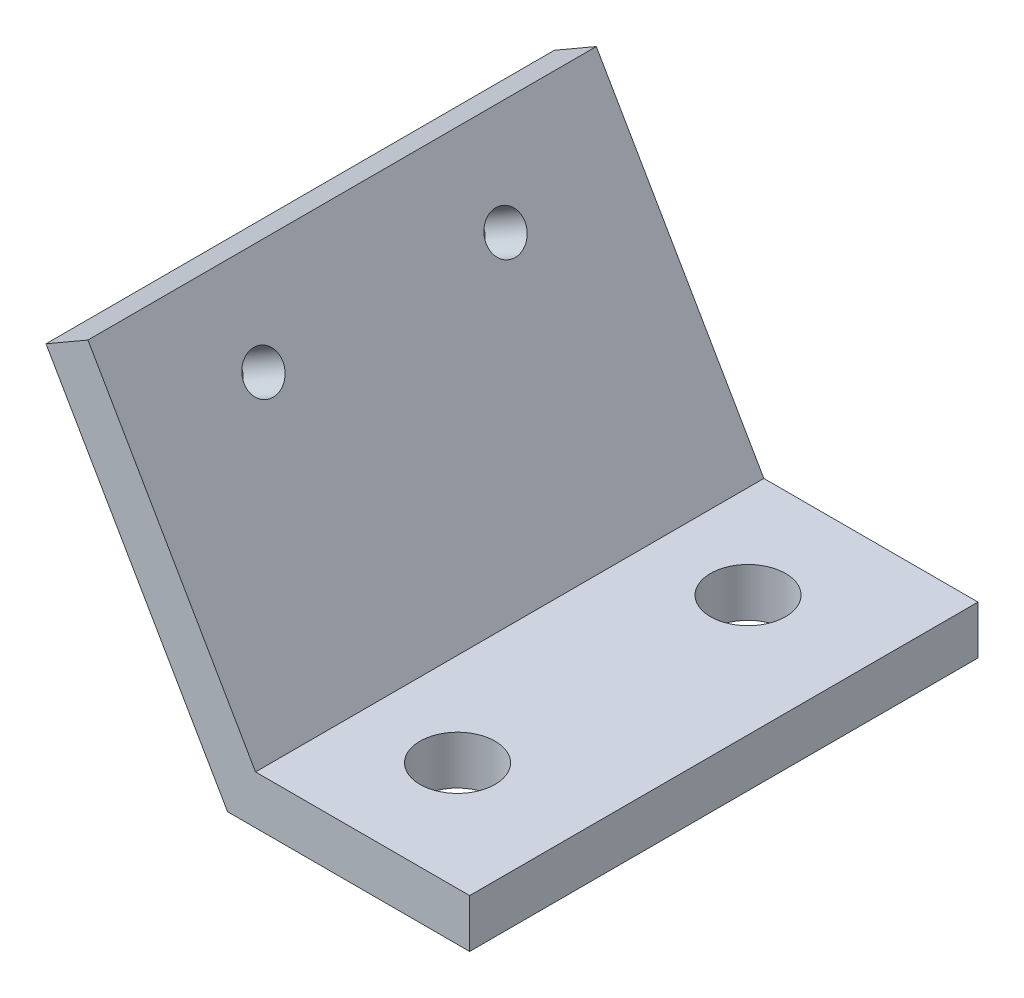
ISO-10303-21;
HEADER;
FILE_DESCRIPTION(('STEP AP214'),'2;1');
FILE_NAME('part.step','',(''),(''),'','','');
FILE_SCHEMA(('AUTOMOTIVE_DESIGN { 1 0 10303 214 1 1 1 1 }'));
ENDSEC;
DATA;
#1=APPLICATION_CONTEXT('core data for automotive mechanical design processes');
#2=APPLICATION_PROTOCOL_DEFINITION('international standard','automotive_design',2000,#1);
#3=PRODUCT_CONTEXT('',#1,'mechanical');
#4=PRODUCT('Part','Part','',(#3));
#5=PRODUCT_RELATED_PRODUCT_CATEGORY('part','',(#4));
#6=PRODUCT_DEFINITION_FORMATION('','',#4);
#7=PRODUCT_DEFINITION_CONTEXT('part definition',#1,'design');
#8=PRODUCT_DEFINITION('design','',#6,#7);
#9=PRODUCT_DEFINITION_SHAPE('','',#8);
#10=(LENGTH_UNIT() NAMED_UNIT(*) SI_UNIT(.MILLI.,.METRE.));
#11=(NAMED_UNIT(*) PLANE_ANGLE_UNIT() SI_UNIT($,.RADIAN.));
#12=(NAMED_UNIT(*) SI_UNIT($,.STERADIAN.) SOLID_ANGLE_UNIT());
#13=UNCERTAINTY_MEASURE_WITH_UNIT(LENGTH_MEASURE(1.E-05),#10,'distance_accuracy_value','');
#14=(GEOMETRIC_REPRESENTATION_CONTEXT(3) GLOBAL_UNCERTAINTY_ASSIGNED_CONTEXT((#13)) GLOBAL_UNIT_ASSIGNED_CONTEXT((#10,
#11,#12)) REPRESENTATION_CONTEXT('',''));
#15=CARTESIAN_POINT('',(0.,0.,0.));
#16=DIRECTION('',(0.,0.,1.));
#17=DIRECTION('',(1.,0.,0.));
#18=AXIS2_PLACEMENT_3D('',#15,#16,#17);
#19=CARTESIAN_POINT('',(-46.2359259339853,-3.805163094229,42.));
#20=DIRECTION('',(-0.866025403784439,-0.5,0.));
#21=DIRECTION('',(0.5,-0.866025403784439,0.));
#22=AXIS2_PLACEMENT_3D('',#19,#20,#21);
#23=PLANE('',#22);
#24=CARTESIAN_POINT('',(-42.7359259339853,-9.86734092072007,31.));
#25=DIRECTION('',(-0.866025403784439,-0.5,0.));
#26=DIRECTION('',(0.5,-0.866025403784439,0.));
#27=AXIS2_PLACEMENT_3D('',#24,#25,#26);
#28=CIRCLE('',#27,1.6);
#29=CARTESIAN_POINT('',(-41.9359259339853,-11.2529815667752,31.));
#30=VERTEX_POINT('',#29);
#31=EDGE_CURVE('E1376',#30,#30,#28,.T.);
#32=ORIENTED_EDGE('',*,*,#31,.T.);
#33=EDGE_LOOP('',(#32));
#34=FACE_BOUND('',#33,.T.);
#35=CARTESIAN_POINT('',(-42.7359259339853,-9.86734092072007,11.));
#36=DIRECTION('',(-0.866025403784439,-0.5,0.));
#37=DIRECTION('',(0.5,-0.866025403784439,0.));
#38=AXIS2_PLACEMENT_3D('',#35,#36,#37);
#39=CIRCLE('',#38,1.6);
#40=CARTESIAN_POINT('',(-41.9359259339853,-11.2529815667752,11.));
#41=VERTEX_POINT('',#40);
#42=EDGE_CURVE('E1404',#41,#41,#39,.T.);
#43=ORIENTED_EDGE('',*,*,#42,.T.);
#44=EDGE_LOOP('',(#43));
#45=FACE_BOUND('',#44,.T.);
#46=DIRECTION('',(-0.5,0.866025403784438,0.));
#47=VECTOR('',#46,1.);
#48=CARTESIAN_POINT('',(-46.2359259339853,-3.805163094229,0.));
#49=LINE('',#48,#47);
#50=CARTESIAN_POINT('',(-32.3906264723646,-27.7859252077621,0.));
#51=VERTEX_POINT('',#50);
#52=CARTESIAN_POINT('',(-46.2359259339853,-3.805163094229,0.));
#53=VERTEX_POINT('',#52);
#54=EDGE_CURVE('E1374',#51,#53,#49,.T.);
#55=ORIENTED_EDGE('',*,*,#54,.T.);
#56=DIRECTION('',(0.,0.,-1.));
#57=VECTOR('',#56,1.);
#58=CARTESIAN_POINT('',(-46.2359259339853,-3.805163094229,42.));
#59=LINE('',#58,#57);
#60=CARTESIAN_POINT('',(-46.2359259339853,-3.805163094229,42.));
#61=VERTEX_POINT('',#60);
#62=EDGE_CURVE('E12',#61,#53,#59,.T.);
#63=ORIENTED_EDGE('',*,*,#62,.F.);
#64=DIRECTION('',(-0.5,0.866025403784438,0.));
#65=VECTOR('',#64,1.);
#66=CARTESIAN_POINT('',(-46.2359259339853,-3.805163094229,42.));
#67=LINE('',#66,#65);
#68=CARTESIAN_POINT('',(-32.3906264723646,-27.7859252077621,42.));
#69=VERTEX_POINT('',#68);
#70=EDGE_CURVE('E1386',#69,#61,#67,.T.);
#71=ORIENTED_EDGE('',*,*,#70,.F.);
#72=DIRECTION('',(0.,0.,-1.));
#73=VECTOR('',#72,1.);
#74=CARTESIAN_POINT('',(-32.3906264723646,-27.7859252077621,42.));
#75=LINE('',#74,#73);
#76=EDGE_CURVE('E1370',#69,#51,#75,.T.);
#77=ORIENTED_EDGE('',*,*,#76,.T.);
#78=EDGE_LOOP('',(#55,#63,#71,#77));
#79=FACE_BOUND('',#78,.T.);
#80=ADVANCED_FACE('F1281',(#34,#45,#79),#23,.F.);
#81=CARTESIAN_POINT('',(-49.7000275491231,-5.805163094229,42.));
#82=DIRECTION('',(0.500000000000002,-0.866025403784438,0.));
#83=DIRECTION('',(0.866025403784438,0.500000000000002,0.));
#84=AXIS2_PLACEMENT_3D('',#81,#82,#83);
#85=PLANE('',#84);
#86=DIRECTION('',(-0.866025403784438,-0.500000000000002,0.));
#87=VECTOR('',#86,1.);
#88=CARTESIAN_POINT('',(-49.7000275491231,-5.805163094229,0.));
#89=LINE('',#88,#87);
#90=CARTESIAN_POINT('',(-49.7000275491231,-5.805163094229,0.));
#91=VERTEX_POINT('',#90);
#92=EDGE_CURVE('E1380',#53,#91,#89,.T.);
#93=ORIENTED_EDGE('',*,*,#92,.T.);
#94=DIRECTION('',(0.,0.,-1.));
#95=VECTOR('',#94,1.);
#96=CARTESIAN_POINT('',(-49.7000275491231,-5.805163094229,42.));
#97=LINE('',#96,#95);
#98=CARTESIAN_POINT('',(-49.7000275491231,-5.805163094229,42.));
#99=VERTEX_POINT('',#98);
#100=EDGE_CURVE('E1292',#99,#91,#97,.T.);
#101=ORIENTED_EDGE('',*,*,#100,.F.);
#102=DIRECTION('',(-0.866025403784438,-0.500000000000002,0.));
#103=VECTOR('',#102,1.);
#104=CARTESIAN_POINT('',(-49.7000275491231,-5.805163094229,42.));
#105=LINE('',#104,#103);
#106=EDGE_CURVE('E1340',#61,#99,#105,.T.);
#107=ORIENTED_EDGE('',*,*,#106,.F.);
#108=ORIENTED_EDGE('',*,*,#62,.T.);
#109=EDGE_LOOP('',(#93,#101,#107,#108));
#110=FACE_BOUND('',#109,.T.);
#111=ADVANCED_FACE('F1451',(#110),#85,.F.);
#112=CARTESIAN_POINT('',(-34.700027549123,-31.7859252077621,42.));
#113=DIRECTION('',(0.866025403784438,0.500000000000002,0.));
#114=DIRECTION('',(-0.500000000000002,0.866025403784438,0.));
#115=AXIS2_PLACEMENT_3D('',#112,#113,#114);
#116=PLANE('',#115);
#117=CARTESIAN_POINT('',(-46.2000275491231,-11.8673409207201,31.));
#118=DIRECTION('',(0.866025403784438,0.500000000000002,0.));
#119=DIRECTION('',(-0.500000000000002,0.866025403784438,0.));
#120=AXIS2_PLACEMENT_3D('',#117,#118,#119);
#121=CIRCLE('',#120,1.6);
#122=CARTESIAN_POINT('',(-47.0000275491231,-10.481700274665,31.));
#123=VERTEX_POINT('',#122);
#124=EDGE_CURVE('E1402',#123,#123,#121,.T.);
#125=ORIENTED_EDGE('',*,*,#124,.T.);
#126=EDGE_LOOP('',(#125));
#127=FACE_BOUND('',#126,.T.);
#128=CARTESIAN_POINT('',(-46.2000275491231,-11.8673409207201,11.));
#129=DIRECTION('',(0.866025403784438,0.500000000000002,0.));
#130=DIRECTION('',(-0.500000000000002,0.866025403784438,0.));
#131=AXIS2_PLACEMENT_3D('',#128,#129,#130);
#132=CIRCLE('',#131,1.6);
#133=CARTESIAN_POINT('',(-47.0000275491231,-10.481700274665,11.));
#134=VERTEX_POINT('',#133);
#135=EDGE_CURVE('E1399',#134,#134,#132,.T.);
#136=ORIENTED_EDGE('',*,*,#135,.T.);
#137=EDGE_LOOP('',(#136));
#138=FACE_BOUND('',#137,.T.);
#139=DIRECTION('',(0.500000000000002,-0.866025403784438,0.));
#140=VECTOR('',#139,1.);
#141=CARTESIAN_POINT('',(-34.700027549123,-31.7859252077621,0.));
#142=LINE('',#141,#140);
#143=CARTESIAN_POINT('',(-34.700027549123,-31.7859252077621,0.));
#144=VERTEX_POINT('',#143);
#145=EDGE_CURVE('E1382',#91,#144,#142,.T.);
#146=ORIENTED_EDGE('',*,*,#145,.T.);
#147=DIRECTION('',(0.,0.,-1.));
#148=VECTOR('',#147,1.);
#149=CARTESIAN_POINT('',(-34.700027549123,-31.7859252077621,42.));
#150=LINE('',#149,#148);
#151=CARTESIAN_POINT('',(-34.700027549123,-31.7859252077621,42.));
#152=VERTEX_POINT('',#151);
#153=EDGE_CURVE('E1362',#152,#144,#150,.T.);
#154=ORIENTED_EDGE('',*,*,#153,.F.);
#155=DIRECTION('',(0.500000000000002,-0.866025403784438,0.));
#156=VECTOR('',#155,1.);
#157=CARTESIAN_POINT('',(-34.700027549123,-31.7859252077621,42.));
#158=LINE('',#157,#156);
#159=EDGE_CURVE('E1349',#99,#152,#158,.T.);
#160=ORIENTED_EDGE('',*,*,#159,.F.);
#161=ORIENTED_EDGE('',*,*,#100,.T.);
#162=EDGE_LOOP('',(#146,#154,#160,#161));
#163=FACE_BOUND('',#162,.T.);
#164=ADVANCED_FACE('F1459',(#127,#138,#163),#116,.F.);
#165=CARTESIAN_POINT('',(-14.700027549123,-31.7859252077621,42.));
#166=DIRECTION('',(0.,1.,0.));
#167=DIRECTION('',(-1.,0.,0.));
#168=AXIS2_PLACEMENT_3D('',#165,#166,#167);
#169=PLANE('',#168);
#170=CARTESIAN_POINT('',(-24.700027549123,-31.7859252077622,33.));
#171=DIRECTION('',(0.,-1.,0.));
#172=DIRECTION('',(1.,0.,0.));
#173=AXIS2_PLACEMENT_3D('',#170,#171,#172);
#174=CIRCLE('',#173,3.1);
#175=CARTESIAN_POINT('',(-21.600027549123,-31.7859252077622,33.));
#176=VERTEX_POINT('',#175);
#177=EDGE_CURVE('E1411',#176,#176,#174,.T.);
#178=ORIENTED_EDGE('',*,*,#177,.F.);
#179=EDGE_LOOP('',(#178));
#180=FACE_BOUND('',#179,.T.);
#181=CARTESIAN_POINT('',(-24.700027549123,-31.7859252077622,9.));
#182=DIRECTION('',(0.,-1.,0.));
#183=DIRECTION('',(1.,0.,0.));
#184=AXIS2_PLACEMENT_3D('',#181,#182,#183);
#185=CIRCLE('',#184,3.1);
#186=CARTESIAN_POINT('',(-21.600027549123,-31.7859252077622,9.));
#187=VERTEX_POINT('',#186);
#188=EDGE_CURVE('E1418',#187,#187,#185,.T.);
#189=ORIENTED_EDGE('',*,*,#188,.F.);
#190=EDGE_LOOP('',(#189));
#191=FACE_BOUND('',#190,.T.);
#192=DIRECTION('',(1.,0.,0.));
#193=VECTOR('',#192,1.);
#194=CARTESIAN_POINT('',(-14.700027549123,-31.7859252077621,0.));
#195=LINE('',#194,#193);
#196=CARTESIAN_POINT('',(-14.700027549123,-31.7859252077621,0.));
#197=VERTEX_POINT('',#196);
#198=EDGE_CURVE('E1356',#144,#197,#195,.T.);
#199=ORIENTED_EDGE('',*,*,#198,.T.);
#200=DIRECTION('',(0.,0.,-1.));
#201=VECTOR('',#200,1.);
#202=CARTESIAN_POINT('',(-14.700027549123,-31.7859252077621,42.));
#203=LINE('',#202,#201);
#204=CARTESIAN_POINT('',(-14.700027549123,-31.7859252077621,42.));
#205=VERTEX_POINT('',#204);
#206=EDGE_CURVE('E1357',#205,#197,#203,.T.);
#207=ORIENTED_EDGE('',*,*,#206,.F.);
#208=DIRECTION('',(1.,0.,0.));
#209=VECTOR('',#208,1.);
#210=CARTESIAN_POINT('',(-14.700027549123,-31.7859252077621,42.));
#211=LINE('',#210,#209);
#212=EDGE_CURVE('E1342',#152,#205,#211,.T.);
#213=ORIENTED_EDGE('',*,*,#212,.F.);
#214=ORIENTED_EDGE('',*,*,#153,.T.);
#215=EDGE_LOOP('',(#199,#207,#213,#214));
#216=FACE_BOUND('',#215,.T.);
#217=ADVANCED_FACE('F1360',(#180,#191,#216),#169,.F.);
#218=CARTESIAN_POINT('',(-14.700027549123,-27.7859252077621,42.));
#219=DIRECTION('',(-1.,0.,0.));
#220=DIRECTION('',(0.,-1.,0.));
#221=AXIS2_PLACEMENT_3D('',#218,#219,#220);
#222=PLANE('',#221);
#223=DIRECTION('',(0.,1.,0.));
#224=VECTOR('',#223,1.);
#225=CARTESIAN_POINT('',(-14.700027549123,-27.7859252077621,0.));
#226=LINE('',#225,#224);
#227=CARTESIAN_POINT('',(-14.700027549123,-27.7859252077621,0.));
#228=VERTEX_POINT('',#227);
#229=EDGE_CURVE('E1322',#197,#228,#226,.T.);
#230=ORIENTED_EDGE('',*,*,#229,.T.);
#231=DIRECTION('',(0.,0.,-1.));
#232=VECTOR('',#231,1.);
#233=CARTESIAN_POINT('',(-14.700027549123,-27.7859252077621,42.));
#234=LINE('',#233,#232);
#235=CARTESIAN_POINT('',(-14.700027549123,-27.7859252077621,42.));
#236=VERTEX_POINT('',#235);
#237=EDGE_CURVE('E1365',#236,#228,#234,.T.);
#238=ORIENTED_EDGE('',*,*,#237,.F.);
#239=DIRECTION('',(0.,1.,0.));
#240=VECTOR('',#239,1.);
#241=CARTESIAN_POINT('',(-14.700027549123,-27.7859252077621,42.));
#242=LINE('',#241,#240);
#243=EDGE_CURVE('E1348',#205,#236,#242,.T.);
#244=ORIENTED_EDGE('',*,*,#243,.F.);
#245=ORIENTED_EDGE('',*,*,#206,.T.);
#246=EDGE_LOOP('',(#230,#238,#244,#245));
#247=FACE_BOUND('',#246,.T.);
#248=ADVANCED_FACE('F1361',(#247),#222,.F.);
#249=CARTESIAN_POINT('',(-32.3906264723646,-27.7859252077621,42.));
#250=DIRECTION('',(0.,-1.,0.));
#251=DIRECTION('',(1.,0.,0.));
#252=AXIS2_PLACEMENT_3D('',#249,#250,#251);
#253=PLANE('',#252);
#254=CARTESIAN_POINT('',(-24.700027549123,-27.7859252077621,33.));
#255=DIRECTION('',(0.,-1.,0.));
#256=DIRECTION('',(1.,0.,0.));
#257=AXIS2_PLACEMENT_3D('',#254,#255,#256);
#258=CIRCLE('',#257,3.1);
#259=CARTESIAN_POINT('',(-21.600027549123,-27.7859252077621,33.));
#260=VERTEX_POINT('',#259);
#261=EDGE_CURVE('E1282',#260,#260,#258,.T.);
#262=ORIENTED_EDGE('',*,*,#261,.T.);
#263=EDGE_LOOP('',(#262));
#264=FACE_BOUND('',#263,.T.);
#265=CARTESIAN_POINT('',(-24.700027549123,-27.7859252077621,9.));
#266=DIRECTION('',(0.,-1.,0.));
#267=DIRECTION('',(1.,0.,0.));
#268=AXIS2_PLACEMENT_3D('',#265,#266,#267);
#269=CIRCLE('',#268,3.1);
#270=CARTESIAN_POINT('',(-21.600027549123,-27.7859252077621,9.));
#271=VERTEX_POINT('',#270);
#272=EDGE_CURVE('E1408',#271,#271,#269,.T.);
#273=ORIENTED_EDGE('',*,*,#272,.T.);
#274=EDGE_LOOP('',(#273));
#275=FACE_BOUND('',#274,.T.);
#276=DIRECTION('',(-1.,0.,0.));
#277=VECTOR('',#276,1.);
#278=CARTESIAN_POINT('',(-32.3906264723646,-27.7859252077621,0.));
#279=LINE('',#278,#277);
#280=EDGE_CURVE('E1328',#228,#51,#279,.T.);
#281=ORIENTED_EDGE('',*,*,#280,.T.);
#282=ORIENTED_EDGE('',*,*,#76,.F.);
#283=DIRECTION('',(-1.,0.,0.));
#284=VECTOR('',#283,1.);
#285=CARTESIAN_POINT('',(-32.3906264723646,-27.7859252077621,42.));
#286=LINE('',#285,#284);
#287=EDGE_CURVE('E1298',#236,#69,#286,.T.);
#288=ORIENTED_EDGE('',*,*,#287,.F.);
#289=ORIENTED_EDGE('',*,*,#237,.T.);
#290=EDGE_LOOP('',(#281,#282,#288,#289));
#291=FACE_BOUND('',#290,.T.);
#292=ADVANCED_FACE('F1461',(#264,#275,#291),#253,.F.);
#293=CARTESIAN_POINT('',(0.,0.,42.));
#294=DIRECTION('',(0.,0.,1.));
#295=DIRECTION('',(1.,0.,0.));
#296=AXIS2_PLACEMENT_3D('',#293,#294,#295);
#297=PLANE('',#296);
#298=ORIENTED_EDGE('',*,*,#70,.T.);
#299=ORIENTED_EDGE('',*,*,#106,.T.);
#300=ORIENTED_EDGE('',*,*,#159,.T.);
#301=ORIENTED_EDGE('',*,*,#212,.T.);
#302=ORIENTED_EDGE('',*,*,#243,.T.);
#303=ORIENTED_EDGE('',*,*,#287,.T.);
#304=EDGE_LOOP('',(#298,#299,#300,#301,#302,#303));
#305=FACE_BOUND('',#304,.T.);
#306=ADVANCED_FACE('F1346',(#305),#297,.T.);
#307=CARTESIAN_POINT('',(0.,0.,0.));
#308=DIRECTION('',(0.,0.,1.));
#309=DIRECTION('',(1.,0.,0.));
#310=AXIS2_PLACEMENT_3D('',#307,#308,#309);
#311=PLANE('',#310);
#312=ORIENTED_EDGE('',*,*,#54,.F.);
#313=ORIENTED_EDGE('',*,*,#280,.F.);
#314=ORIENTED_EDGE('',*,*,#229,.F.);
#315=ORIENTED_EDGE('',*,*,#198,.F.);
#316=ORIENTED_EDGE('',*,*,#145,.F.);
#317=ORIENTED_EDGE('',*,*,#92,.F.);
#318=EDGE_LOOP('',(#312,#313,#314,#315,#316,#317));
#319=FACE_BOUND('',#318,.T.);
#320=ADVANCED_FACE('F1463',(#319),#311,.F.);
#321=CARTESIAN_POINT('',(-19.0840021453387,3.78810364550767,11.));
#322=DIRECTION('',(-0.866025403784438,-0.500000000000002,0.));
#323=DIRECTION('',(0.500000000000002,-0.866025403784438,0.));
#324=AXIS2_PLACEMENT_3D('',#321,#322,#323);
#325=CYLINDRICAL_SURFACE('',#324,1.6);
#326=ORIENTED_EDGE('',*,*,#135,.F.);
#327=EDGE_LOOP('',(#326));
#328=FACE_BOUND('',#327,.T.);
#329=ORIENTED_EDGE('',*,*,#42,.F.);
#330=EDGE_LOOP('',(#329));
#331=FACE_BOUND('',#330,.T.);
#332=ADVANCED_FACE('F1490',(#328,#331),#325,.F.);
#333=CARTESIAN_POINT('',(-19.0840021453387,3.78810364550767,31.));
#334=DIRECTION('',(-0.866025403784438,-0.500000000000002,0.));
#335=DIRECTION('',(0.500000000000002,-0.866025403784438,0.));
#336=AXIS2_PLACEMENT_3D('',#333,#334,#335);
#337=CYLINDRICAL_SURFACE('',#336,1.6);
#338=ORIENTED_EDGE('',*,*,#124,.F.);
#339=EDGE_LOOP('',(#338));
#340=FACE_BOUND('',#339,.T.);
#341=ORIENTED_EDGE('',*,*,#31,.F.);
#342=EDGE_LOOP('',(#341));
#343=FACE_BOUND('',#342,.T.);
#344=ADVANCED_FACE('F1486',(#340,#343),#337,.F.);
#345=CARTESIAN_POINT('',(-24.700027549123,-3.80516309422899,9.));
#346=DIRECTION('',(0.,-1.,0.));
#347=DIRECTION('',(1.,0.,0.));
#348=AXIS2_PLACEMENT_3D('',#345,#346,#347);
#349=CYLINDRICAL_SURFACE('',#348,3.1);
#350=ORIENTED_EDGE('',*,*,#188,.T.);
#351=EDGE_LOOP('',(#350));
#352=FACE_BOUND('',#351,.T.);
#353=ORIENTED_EDGE('',*,*,#272,.F.);
#354=EDGE_LOOP('',(#353));
#355=FACE_BOUND('',#354,.T.);
#356=ADVANCED_FACE('F1493',(#352,#355),#349,.F.);
#357=CARTESIAN_POINT('',(-24.700027549123,-3.80516309422899,33.));
#358=DIRECTION('',(0.,-1.,0.));
#359=DIRECTION('',(1.,0.,0.));
#360=AXIS2_PLACEMENT_3D('',#357,#358,#359);
#361=CYLINDRICAL_SURFACE('',#360,3.1);
#362=ORIENTED_EDGE('',*,*,#177,.T.);
#363=EDGE_LOOP('',(#362));
#364=FACE_BOUND('',#363,.T.);
#365=ORIENTED_EDGE('',*,*,#261,.F.);
#366=EDGE_LOOP('',(#365));
#367=FACE_BOUND('',#366,.T.);
#368=ADVANCED_FACE('F1501',(#364,#367),#361,.F.);
#369=CLOSED_SHELL('',(#80,#111,#164,#217,#248,#292,#306,#320,#332,#344,#356,#368));
#370=MANIFOLD_SOLID_BREP('B2',#369);
#371=ADVANCED_BREP_SHAPE_REPRESENTATION('',(#18,#370),#14);
#372=SHAPE_DEFINITION_REPRESENTATION(#9,#371);
ENDSEC;
END-ISO-10303-21;
